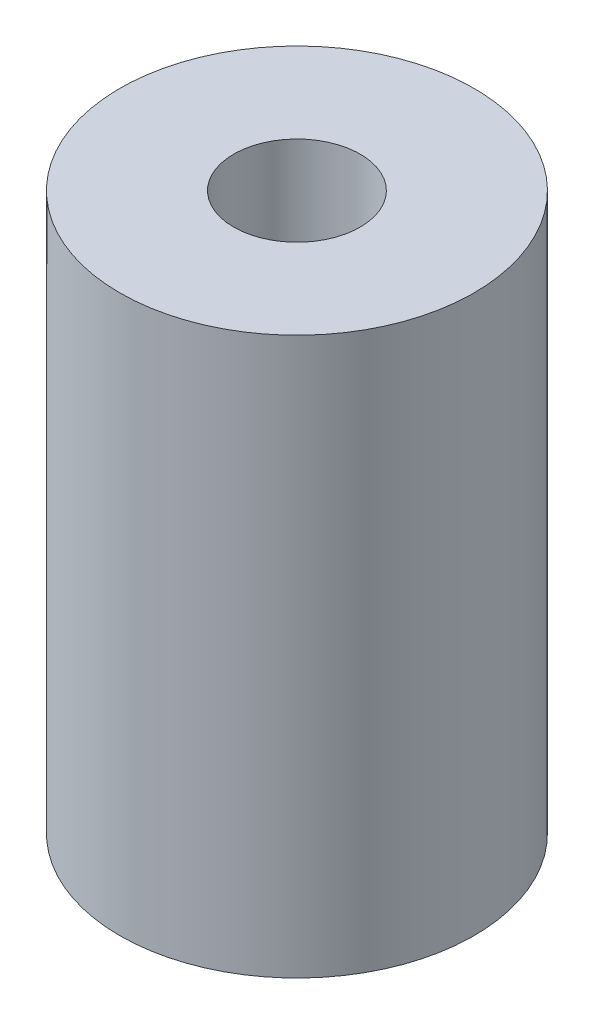
ISO-10303-21;
HEADER;
FILE_DESCRIPTION(('STEP AP214'),'2;1');
FILE_NAME('part.step','',(''),(''),'','','');
FILE_SCHEMA(('AUTOMOTIVE_DESIGN { 1 0 10303 214 1 1 1 1 }'));
ENDSEC;
DATA;
#1=APPLICATION_CONTEXT('core data for automotive mechanical design processes');
#2=APPLICATION_PROTOCOL_DEFINITION('international standard','automotive_design',2000,#1);
#3=PRODUCT_CONTEXT('',#1,'mechanical');
#4=PRODUCT('Part','Part','',(#3));
#5=PRODUCT_RELATED_PRODUCT_CATEGORY('part','',(#4));
#6=PRODUCT_DEFINITION_FORMATION('','',#4);
#7=PRODUCT_DEFINITION_CONTEXT('part definition',#1,'design');
#8=PRODUCT_DEFINITION('design','',#6,#7);
#9=PRODUCT_DEFINITION_SHAPE('','',#8);
#10=(LENGTH_UNIT() NAMED_UNIT(*) SI_UNIT(.MILLI.,.METRE.));
#11=(NAMED_UNIT(*) PLANE_ANGLE_UNIT() SI_UNIT($,.RADIAN.));
#12=(NAMED_UNIT(*) SI_UNIT($,.STERADIAN.) SOLID_ANGLE_UNIT());
#13=UNCERTAINTY_MEASURE_WITH_UNIT(LENGTH_MEASURE(1.E-05),#10,'distance_accuracy_value','');
#14=(GEOMETRIC_REPRESENTATION_CONTEXT(3) GLOBAL_UNCERTAINTY_ASSIGNED_CONTEXT((#13)) GLOBAL_UNIT_ASSIGNED_CONTEXT((#10,
#11,#12)) REPRESENTATION_CONTEXT('',''));
#15=CARTESIAN_POINT('',(0.,0.,0.));
#16=DIRECTION('',(0.,0.,1.));
#17=DIRECTION('',(1.,0.,0.));
#18=AXIS2_PLACEMENT_3D('',#15,#16,#17);
#19=CARTESIAN_POINT('',(0.,0.,0.));
#20=DIRECTION('',(0.,1.,0.));
#21=DIRECTION('',(0.,0.,1.));
#22=AXIS2_PLACEMENT_3D('',#19,#20,#21);
#23=CYLINDRICAL_SURFACE('',#22,2.5);
#24=CARTESIAN_POINT('',(0.,22.,0.));
#25=DIRECTION('',(0.,1.,0.));
#26=DIRECTION('',(0.,0.,1.));
#27=AXIS2_PLACEMENT_3D('',#24,#25,#26);
#28=CIRCLE('',#27,2.5);
#29=CARTESIAN_POINT('',(0.,22.,2.5));
#30=VERTEX_POINT('',#29);
#31=EDGE_CURVE('E52',#30,#30,#28,.T.);
#32=ORIENTED_EDGE('',*,*,#31,.T.);
#33=EDGE_LOOP('',(#32));
#34=FACE_BOUND('',#33,.T.);
#35=CARTESIAN_POINT('',(0.,11.,0.));
#36=DIRECTION('',(0.,-1.,0.));
#37=DIRECTION('',(0.,0.,-1.));
#38=AXIS2_PLACEMENT_3D('',#35,#36,#37);
#39=CIRCLE('',#38,2.5);
#40=CARTESIAN_POINT('',(0.,11.,-2.5));
#41=VERTEX_POINT('',#40);
#42=EDGE_CURVE('E43',#41,#41,#39,.F.);
#43=ORIENTED_EDGE('',*,*,#42,.F.);
#44=EDGE_LOOP('',(#43));
#45=FACE_BOUND('',#44,.T.);
#46=ADVANCED_FACE('F39',(#34,#45),#23,.F.);
#47=CARTESIAN_POINT('',(0.,22.,0.));
#48=DIRECTION('',(0.,-1.,0.));
#49=DIRECTION('',(0.,0.,-1.));
#50=AXIS2_PLACEMENT_3D('',#47,#48,#49);
#51=CYLINDRICAL_SURFACE('',#50,7.);
#52=CARTESIAN_POINT('',(0.,22.,0.));
#53=DIRECTION('',(0.,1.,0.));
#54=DIRECTION('',(0.,0.,1.));
#55=AXIS2_PLACEMENT_3D('',#52,#53,#54);
#56=CIRCLE('',#55,7.);
#57=CARTESIAN_POINT('',(0.,22.,7.));
#58=VERTEX_POINT('',#57);
#59=EDGE_CURVE('E10',#58,#58,#56,.T.);
#60=ORIENTED_EDGE('',*,*,#59,.F.);
#61=EDGE_LOOP('',(#60));
#62=FACE_BOUND('',#61,.T.);
#63=CARTESIAN_POINT('',(0.,0.,0.));
#64=DIRECTION('',(0.,1.,0.));
#65=DIRECTION('',(0.,0.,1.));
#66=AXIS2_PLACEMENT_3D('',#63,#64,#65);
#67=CIRCLE('',#66,7.);
#68=CARTESIAN_POINT('',(0.,0.,7.));
#69=VERTEX_POINT('',#68);
#70=EDGE_CURVE('E47',#69,#69,#67,.T.);
#71=ORIENTED_EDGE('',*,*,#70,.T.);
#72=EDGE_LOOP('',(#71));
#73=FACE_BOUND('',#72,.T.);
#74=ADVANCED_FACE('F41',(#62,#73),#51,.T.);
#75=CARTESIAN_POINT('',(0.,22.,0.));
#76=DIRECTION('',(0.,1.,0.));
#77=DIRECTION('',(0.,0.,1.));
#78=AXIS2_PLACEMENT_3D('',#75,#76,#77);
#79=PLANE('',#78);
#80=ORIENTED_EDGE('',*,*,#31,.F.);
#81=EDGE_LOOP('',(#80));
#82=FACE_BOUND('',#81,.T.);
#83=ORIENTED_EDGE('',*,*,#59,.T.);
#84=EDGE_LOOP('',(#83));
#85=FACE_BOUND('',#84,.T.);
#86=ADVANCED_FACE('F74',(#82,#85),#79,.T.);
#87=CARTESIAN_POINT('',(0.,0.,0.));
#88=DIRECTION('',(0.,1.,0.));
#89=DIRECTION('',(0.,0.,1.));
#90=AXIS2_PLACEMENT_3D('',#87,#88,#89);
#91=PLANE('',#90);
#92=CARTESIAN_POINT('',(0.,0.,0.));
#93=DIRECTION('',(0.,-1.,0.));
#94=DIRECTION('',(0.,0.,-1.));
#95=AXIS2_PLACEMENT_3D('',#92,#93,#94);
#96=CIRCLE('',#95,3.);
#97=CARTESIAN_POINT('',(0.,0.,-3.));
#98=VERTEX_POINT('',#97);
#99=EDGE_CURVE('E56',#98,#98,#96,.T.);
#100=ORIENTED_EDGE('',*,*,#99,.F.);
#101=EDGE_LOOP('',(#100));
#102=FACE_BOUND('',#101,.T.);
#103=ORIENTED_EDGE('',*,*,#70,.F.);
#104=EDGE_LOOP('',(#103));
#105=FACE_BOUND('',#104,.T.);
#106=ADVANCED_FACE('F81',(#102,#105),#91,.F.);
#107=CARTESIAN_POINT('',(0.,11.,0.));
#108=DIRECTION('',(0.,-1.,0.));
#109=DIRECTION('',(0.,0.,-1.));
#110=AXIS2_PLACEMENT_3D('',#107,#108,#109);
#111=PLANE('',#110);
#112=CARTESIAN_POINT('',(0.,11.,0.));
#113=DIRECTION('',(0.,-1.,0.));
#114=DIRECTION('',(0.,0.,-1.));
#115=AXIS2_PLACEMENT_3D('',#112,#113,#114);
#116=CIRCLE('',#115,3.);
#117=CARTESIAN_POINT('',(0.,11.,-3.));
#118=VERTEX_POINT('',#117);
#119=EDGE_CURVE('E59',#118,#118,#116,.T.);
#120=ORIENTED_EDGE('',*,*,#119,.T.);
#121=EDGE_LOOP('',(#120));
#122=FACE_BOUND('',#121,.T.);
#123=ORIENTED_EDGE('',*,*,#42,.T.);
#124=EDGE_LOOP('',(#123));
#125=FACE_BOUND('',#124,.T.);
#126=ADVANCED_FACE('F66',(#122,#125),#111,.T.);
#127=CARTESIAN_POINT('',(0.,11.,0.));
#128=DIRECTION('',(0.,-1.,0.));
#129=DIRECTION('',(0.,0.,-1.));
#130=AXIS2_PLACEMENT_3D('',#127,#128,#129);
#131=CYLINDRICAL_SURFACE('',#130,3.);
#132=ORIENTED_EDGE('',*,*,#119,.F.);
#133=EDGE_LOOP('',(#132));
#134=FACE_BOUND('',#133,.T.);
#135=ORIENTED_EDGE('',*,*,#99,.T.);
#136=EDGE_LOOP('',(#135));
#137=FACE_BOUND('',#136,.T.);
#138=ADVANCED_FACE('F78',(#134,#137),#131,.F.);
#139=CLOSED_SHELL('',(#46,#74,#86,#106,#126,#138));
#140=MANIFOLD_SOLID_BREP('B2',#139);
#141=ADVANCED_BREP_SHAPE_REPRESENTATION('',(#18,#140),#14);
#142=SHAPE_DEFINITION_REPRESENTATION(#9,#141);
ENDSEC;
END-ISO-10303-21;
